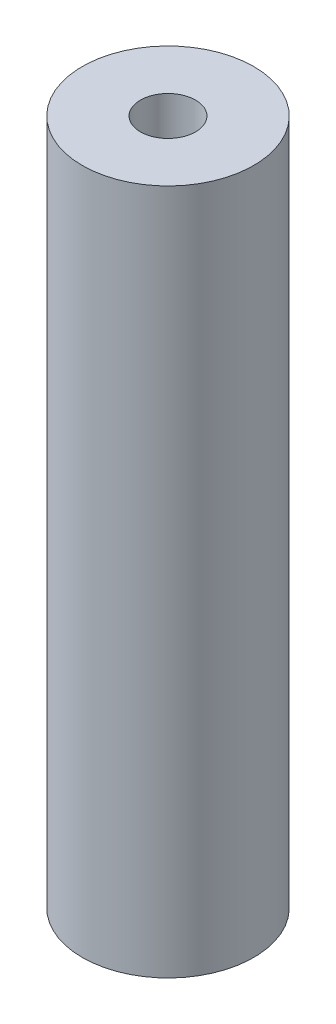
ISO-10303-21;
HEADER;
FILE_DESCRIPTION(('STEP AP214'),'2;1');
FILE_NAME('part.step','',(''),(''),'','','');
FILE_SCHEMA(('AUTOMOTIVE_DESIGN { 1 0 10303 214 1 1 1 1 }'));
ENDSEC;
DATA;
#1=APPLICATION_CONTEXT('core data for automotive mechanical design processes');
#2=APPLICATION_PROTOCOL_DEFINITION('international standard','automotive_design',2000,#1);
#3=PRODUCT_CONTEXT('',#1,'mechanical');
#4=PRODUCT('Part','Part','',(#3));
#5=PRODUCT_RELATED_PRODUCT_CATEGORY('part','',(#4));
#6=PRODUCT_DEFINITION_FORMATION('','',#4);
#7=PRODUCT_DEFINITION_CONTEXT('part definition',#1,'design');
#8=PRODUCT_DEFINITION('design','',#6,#7);
#9=PRODUCT_DEFINITION_SHAPE('','',#8);
#10=(LENGTH_UNIT() NAMED_UNIT(*) SI_UNIT(.MILLI.,.METRE.));
#11=(NAMED_UNIT(*) PLANE_ANGLE_UNIT() SI_UNIT($,.RADIAN.));
#12=(NAMED_UNIT(*) SI_UNIT($,.STERADIAN.) SOLID_ANGLE_UNIT());
#13=UNCERTAINTY_MEASURE_WITH_UNIT(LENGTH_MEASURE(1.E-05),#10,'distance_accuracy_value','');
#14=(GEOMETRIC_REPRESENTATION_CONTEXT(3) GLOBAL_UNCERTAINTY_ASSIGNED_CONTEXT((#13)) GLOBAL_UNIT_ASSIGNED_CONTEXT((#10,
#11,#12)) REPRESENTATION_CONTEXT('',''));
#15=CARTESIAN_POINT('',(0.,0.,0.));
#16=DIRECTION('',(0.,0.,1.));
#17=DIRECTION('',(1.,0.,0.));
#18=AXIS2_PLACEMENT_3D('',#15,#16,#17);
#19=CARTESIAN_POINT('',(0.,63.5,0.));
#20=DIRECTION('',(0.,1.,0.));
#21=DIRECTION('',(0.,0.,1.));
#22=AXIS2_PLACEMENT_3D('',#19,#20,#21);
#23=CYLINDRICAL_SURFACE('',#22,2.5527);
#24=CARTESIAN_POINT('',(0.,63.5,0.));
#25=DIRECTION('',(0.,1.,0.));
#26=DIRECTION('',(0.,0.,1.));
#27=AXIS2_PLACEMENT_3D('',#24,#25,#26);
#28=CIRCLE('',#27,2.5527);
#29=CARTESIAN_POINT('',(0.,63.5,2.5527));
#30=VERTEX_POINT('',#29);
#31=EDGE_CURVE('E18',#30,#30,#28,.F.);
#32=ORIENTED_EDGE('',*,*,#31,.F.);
#33=EDGE_LOOP('',(#32));
#34=FACE_BOUND('',#33,.T.);
#35=CARTESIAN_POINT('',(0.,0.,0.));
#36=DIRECTION('',(0.,1.,0.));
#37=DIRECTION('',(0.,0.,1.));
#38=AXIS2_PLACEMENT_3D('',#35,#36,#37);
#39=CIRCLE('',#38,2.5527);
#40=CARTESIAN_POINT('',(0.,0.,2.5527));
#41=VERTEX_POINT('',#40);
#42=EDGE_CURVE('E27',#41,#41,#39,.F.);
#43=ORIENTED_EDGE('',*,*,#42,.T.);
#44=EDGE_LOOP('',(#43));
#45=FACE_BOUND('',#44,.T.);
#46=ADVANCED_FACE('F15',(#34,#45),#23,.F.);
#47=CARTESIAN_POINT('',(0.,63.5,0.));
#48=DIRECTION('',(0.,1.,0.));
#49=DIRECTION('',(0.,0.,1.));
#50=AXIS2_PLACEMENT_3D('',#47,#48,#49);
#51=PLANE('',#50);
#52=ORIENTED_EDGE('',*,*,#31,.T.);
#53=EDGE_LOOP('',(#52));
#54=FACE_BOUND('',#53,.T.);
#55=CARTESIAN_POINT('',(0.,63.5,0.));
#56=DIRECTION('',(0.,1.,0.));
#57=DIRECTION('',(0.,0.,1.));
#58=AXIS2_PLACEMENT_3D('',#55,#56,#57);
#59=CIRCLE('',#58,7.9375);
#60=CARTESIAN_POINT('',(0.,63.5,7.9375));
#61=VERTEX_POINT('',#60);
#62=EDGE_CURVE('E22',#61,#61,#59,.F.);
#63=ORIENTED_EDGE('',*,*,#62,.F.);
#64=EDGE_LOOP('',(#63));
#65=FACE_BOUND('',#64,.T.);
#66=ADVANCED_FACE('F35',(#54,#65),#51,.T.);
#67=CARTESIAN_POINT('',(0.,0.,0.));
#68=DIRECTION('',(0.,1.,0.));
#69=DIRECTION('',(0.,0.,1.));
#70=AXIS2_PLACEMENT_3D('',#67,#68,#69);
#71=PLANE('',#70);
#72=ORIENTED_EDGE('',*,*,#42,.F.);
#73=EDGE_LOOP('',(#72));
#74=FACE_BOUND('',#73,.T.);
#75=CARTESIAN_POINT('',(0.,0.,0.));
#76=DIRECTION('',(0.,1.,0.));
#77=DIRECTION('',(0.,0.,1.));
#78=AXIS2_PLACEMENT_3D('',#75,#76,#77);
#79=CIRCLE('',#78,7.9375);
#80=CARTESIAN_POINT('',(0.,0.,7.9375));
#81=VERTEX_POINT('',#80);
#82=EDGE_CURVE('E10',#81,#81,#79,.T.);
#83=ORIENTED_EDGE('',*,*,#82,.F.);
#84=EDGE_LOOP('',(#83));
#85=FACE_BOUND('',#84,.T.);
#86=ADVANCED_FACE('F43',(#74,#85),#71,.F.);
#87=CARTESIAN_POINT('',(0.,0.,0.));
#88=DIRECTION('',(0.,1.,0.));
#89=DIRECTION('',(0.,0.,1.));
#90=AXIS2_PLACEMENT_3D('',#87,#88,#89);
#91=CYLINDRICAL_SURFACE('',#90,7.9375);
#92=ORIENTED_EDGE('',*,*,#62,.T.);
#93=EDGE_LOOP('',(#92));
#94=FACE_BOUND('',#93,.T.);
#95=ORIENTED_EDGE('',*,*,#82,.T.);
#96=EDGE_LOOP('',(#95));
#97=FACE_BOUND('',#96,.T.);
#98=ADVANCED_FACE('F44',(#94,#97),#91,.T.);
#99=CLOSED_SHELL('',(#46,#66,#86,#98));
#100=MANIFOLD_SOLID_BREP('B1',#99);
#101=ADVANCED_BREP_SHAPE_REPRESENTATION('',(#18,#100),#14);
#102=SHAPE_DEFINITION_REPRESENTATION(#9,#101);
ENDSEC;
END-ISO-10303-21;
